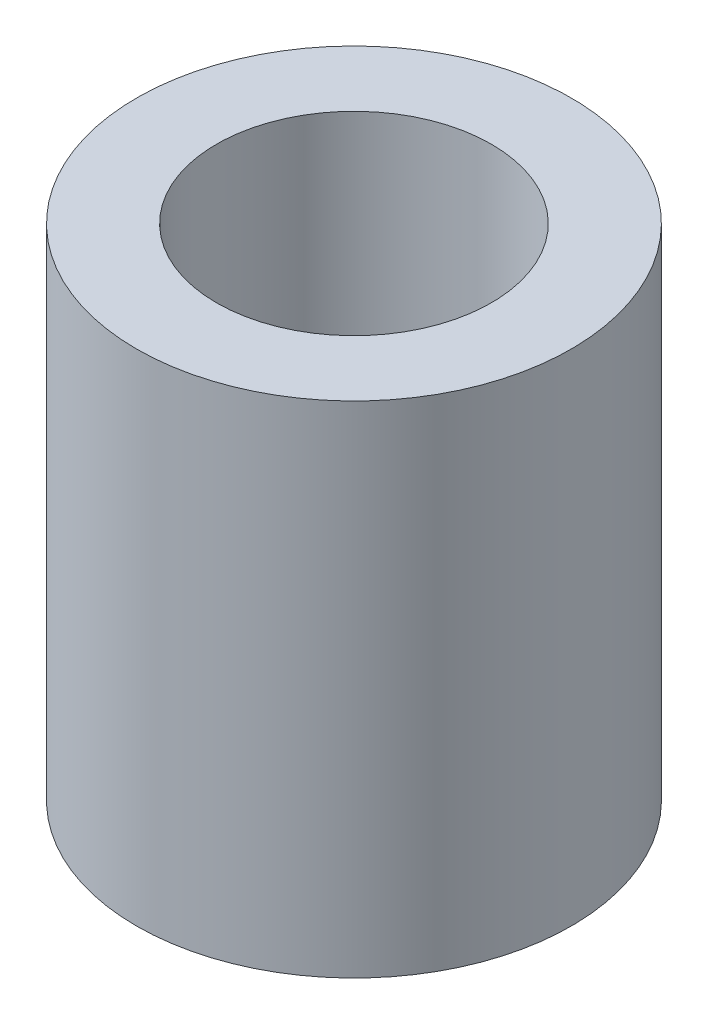
ISO-10303-21;
HEADER;
FILE_DESCRIPTION(('STEP AP214'),'2;1');
FILE_NAME('part.step','',(''),(''),'','','');
FILE_SCHEMA(('AUTOMOTIVE_DESIGN { 1 0 10303 214 1 1 1 1 }'));
ENDSEC;
DATA;
#1=APPLICATION_CONTEXT('core data for automotive mechanical design processes');
#2=APPLICATION_PROTOCOL_DEFINITION('international standard','automotive_design',2000,#1);
#3=PRODUCT_CONTEXT('',#1,'mechanical');
#4=PRODUCT('Part','Part','',(#3));
#5=PRODUCT_RELATED_PRODUCT_CATEGORY('part','',(#4));
#6=PRODUCT_DEFINITION_FORMATION('','',#4);
#7=PRODUCT_DEFINITION_CONTEXT('part definition',#1,'design');
#8=PRODUCT_DEFINITION('design','',#6,#7);
#9=PRODUCT_DEFINITION_SHAPE('','',#8);
#10=(LENGTH_UNIT() NAMED_UNIT(*) SI_UNIT(.MILLI.,.METRE.));
#11=(NAMED_UNIT(*) PLANE_ANGLE_UNIT() SI_UNIT($,.RADIAN.));
#12=(NAMED_UNIT(*) SI_UNIT($,.STERADIAN.) SOLID_ANGLE_UNIT());
#13=UNCERTAINTY_MEASURE_WITH_UNIT(LENGTH_MEASURE(1.E-05),#10,'distance_accuracy_value','');
#14=(GEOMETRIC_REPRESENTATION_CONTEXT(3) GLOBAL_UNCERTAINTY_ASSIGNED_CONTEXT((#13)) GLOBAL_UNIT_ASSIGNED_CONTEXT((#10,
#11,#12)) REPRESENTATION_CONTEXT('',''));
#15=CARTESIAN_POINT('',(0.,0.,0.));
#16=DIRECTION('',(0.,0.,1.));
#17=DIRECTION('',(1.,0.,0.));
#18=AXIS2_PLACEMENT_3D('',#15,#16,#17);
#19=CARTESIAN_POINT('',(0.,10.,0.));
#20=DIRECTION('',(0.,-1.,0.));
#21=DIRECTION('',(0.,0.,-1.));
#22=AXIS2_PLACEMENT_3D('',#19,#20,#21);
#23=CYLINDRICAL_SURFACE('',#22,4.35);
#24=CARTESIAN_POINT('',(0.,10.,0.));
#25=DIRECTION('',(0.,1.,0.));
#26=DIRECTION('',(0.,0.,1.));
#27=AXIS2_PLACEMENT_3D('',#24,#25,#26);
#28=CIRCLE('',#27,4.35);
#29=CARTESIAN_POINT('',(0.,10.,4.35));
#30=VERTEX_POINT('',#29);
#31=EDGE_CURVE('E10',#30,#30,#28,.T.);
#32=ORIENTED_EDGE('',*,*,#31,.F.);
#33=EDGE_LOOP('',(#32));
#34=FACE_BOUND('',#33,.T.);
#35=CARTESIAN_POINT('',(0.,0.,0.));
#36=DIRECTION('',(0.,1.,0.));
#37=DIRECTION('',(0.,0.,1.));
#38=AXIS2_PLACEMENT_3D('',#35,#36,#37);
#39=CIRCLE('',#38,4.35);
#40=CARTESIAN_POINT('',(0.,0.,4.35));
#41=VERTEX_POINT('',#40);
#42=EDGE_CURVE('E34',#41,#41,#39,.T.);
#43=ORIENTED_EDGE('',*,*,#42,.T.);
#44=EDGE_LOOP('',(#43));
#45=FACE_BOUND('',#44,.T.);
#46=ADVANCED_FACE('F31',(#34,#45),#23,.T.);
#47=CARTESIAN_POINT('',(0.,10.,0.));
#48=DIRECTION('',(0.,1.,0.));
#49=DIRECTION('',(0.,0.,1.));
#50=AXIS2_PLACEMENT_3D('',#47,#48,#49);
#51=PLANE('',#50);
#52=CARTESIAN_POINT('',(0.,10.,0.));
#53=DIRECTION('',(0.,1.,0.));
#54=DIRECTION('',(0.,0.,1.));
#55=AXIS2_PLACEMENT_3D('',#52,#53,#54);
#56=CIRCLE('',#55,2.75);
#57=CARTESIAN_POINT('',(0.,10.,2.75));
#58=VERTEX_POINT('',#57);
#59=EDGE_CURVE('E43',#58,#58,#56,.T.);
#60=ORIENTED_EDGE('',*,*,#59,.F.);
#61=EDGE_LOOP('',(#60));
#62=FACE_BOUND('',#61,.T.);
#63=ORIENTED_EDGE('',*,*,#31,.T.);
#64=EDGE_LOOP('',(#63));
#65=FACE_BOUND('',#64,.T.);
#66=ADVANCED_FACE('F76',(#62,#65),#51,.T.);
#67=CARTESIAN_POINT('',(0.,0.,0.));
#68=DIRECTION('',(0.,1.,0.));
#69=DIRECTION('',(0.,0.,1.));
#70=AXIS2_PLACEMENT_3D('',#67,#68,#69);
#71=PLANE('',#70);
#72=CARTESIAN_POINT('',(0.,0.,0.));
#73=DIRECTION('',(0.,1.,0.));
#74=DIRECTION('',(0.,0.,1.));
#75=AXIS2_PLACEMENT_3D('',#72,#73,#74);
#76=CIRCLE('',#75,0.475);
#77=CARTESIAN_POINT('',(0.,0.,0.475));
#78=VERTEX_POINT('',#77);
#79=EDGE_CURVE('E46',#78,#78,#76,.T.);
#80=ORIENTED_EDGE('',*,*,#79,.T.);
#81=EDGE_LOOP('',(#80));
#82=FACE_BOUND('',#81,.T.);
#83=ORIENTED_EDGE('',*,*,#42,.F.);
#84=EDGE_LOOP('',(#83));
#85=FACE_BOUND('',#84,.T.);
#86=ADVANCED_FACE('F55',(#82,#85),#71,.F.);
#87=CARTESIAN_POINT('',(0.,0.6,0.));
#88=DIRECTION('',(0.,1.,0.));
#89=DIRECTION('',(0.,0.,1.));
#90=AXIS2_PLACEMENT_3D('',#87,#88,#89);
#91=CYLINDRICAL_SURFACE('',#90,2.75);
#92=CARTESIAN_POINT('',(0.,0.6,0.));
#93=DIRECTION('',(0.,1.,0.));
#94=DIRECTION('',(0.,0.,1.));
#95=AXIS2_PLACEMENT_3D('',#92,#93,#94);
#96=CIRCLE('',#95,2.75);
#97=CARTESIAN_POINT('',(0.,0.6,2.75));
#98=VERTEX_POINT('',#97);
#99=EDGE_CURVE('E41',#98,#98,#96,.T.);
#100=ORIENTED_EDGE('',*,*,#99,.F.);
#101=EDGE_LOOP('',(#100));
#102=FACE_BOUND('',#101,.T.);
#103=ORIENTED_EDGE('',*,*,#59,.T.);
#104=EDGE_LOOP('',(#103));
#105=FACE_BOUND('',#104,.T.);
#106=ADVANCED_FACE('F67',(#102,#105),#91,.F.);
#107=CARTESIAN_POINT('',(0.,0.6,0.));
#108=DIRECTION('',(0.,1.,0.));
#109=DIRECTION('',(0.,0.,1.));
#110=AXIS2_PLACEMENT_3D('',#107,#108,#109);
#111=PLANE('',#110);
#112=CARTESIAN_POINT('',(0.,0.6,0.));
#113=DIRECTION('',(0.,1.,0.));
#114=DIRECTION('',(0.,0.,1.));
#115=AXIS2_PLACEMENT_3D('',#112,#113,#114);
#116=CIRCLE('',#115,0.475);
#117=CARTESIAN_POINT('',(0.,0.6,0.475));
#118=VERTEX_POINT('',#117);
#119=EDGE_CURVE('E49',#118,#118,#116,.T.);
#120=ORIENTED_EDGE('',*,*,#119,.F.);
#121=EDGE_LOOP('',(#120));
#122=FACE_BOUND('',#121,.T.);
#123=ORIENTED_EDGE('',*,*,#99,.T.);
#124=EDGE_LOOP('',(#123));
#125=FACE_BOUND('',#124,.T.);
#126=ADVANCED_FACE('F61',(#122,#125),#111,.T.);
#127=CARTESIAN_POINT('',(0.,0.,0.));
#128=DIRECTION('',(0.,1.,0.));
#129=DIRECTION('',(0.,0.,1.));
#130=AXIS2_PLACEMENT_3D('',#127,#128,#129);
#131=CYLINDRICAL_SURFACE('',#130,0.475);
#132=ORIENTED_EDGE('',*,*,#79,.F.);
#133=EDGE_LOOP('',(#132));
#134=FACE_BOUND('',#133,.T.);
#135=ORIENTED_EDGE('',*,*,#119,.T.);
#136=EDGE_LOOP('',(#135));
#137=FACE_BOUND('',#136,.T.);
#138=ADVANCED_FACE('F58',(#134,#137),#131,.F.);
#139=CLOSED_SHELL('',(#46,#66,#86,#106,#126,#138));
#140=MANIFOLD_SOLID_BREP('B2',#139);
#141=ADVANCED_BREP_SHAPE_REPRESENTATION('',(#18,#140),#14);
#142=SHAPE_DEFINITION_REPRESENTATION(#9,#141);
ENDSEC;
END-ISO-10303-21;
